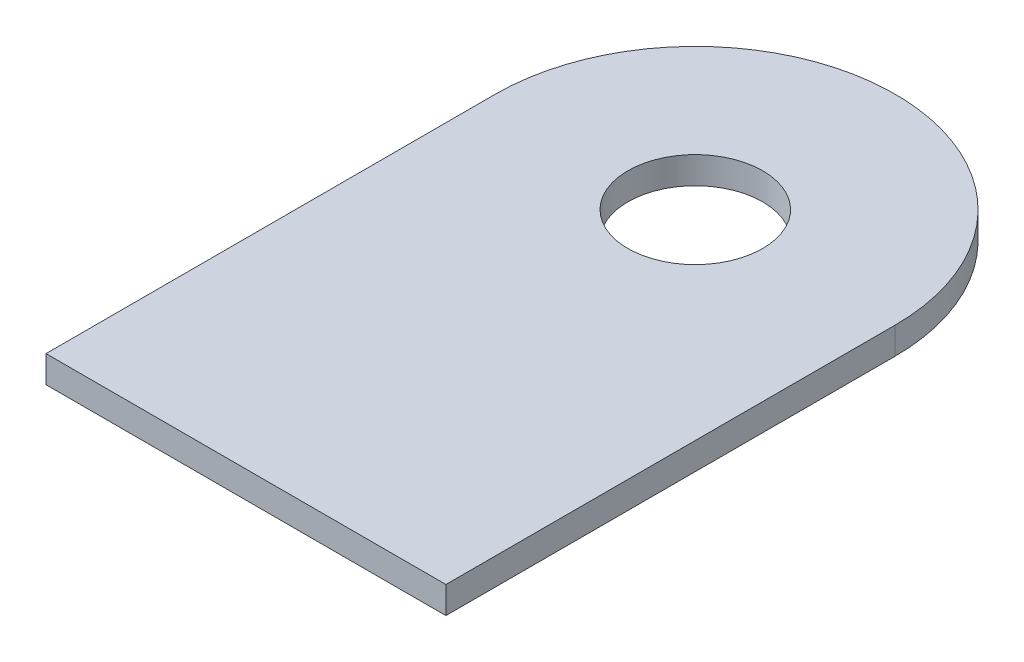
ISO-10303-21;
HEADER;
FILE_DESCRIPTION(('STEP AP214'),'2;1');
FILE_NAME('part.step','',(''),(''),'','','');
FILE_SCHEMA(('AUTOMOTIVE_DESIGN { 1 0 10303 214 1 1 1 1 }'));
ENDSEC;
DATA;
#1=APPLICATION_CONTEXT('core data for automotive mechanical design processes');
#2=APPLICATION_PROTOCOL_DEFINITION('international standard','automotive_design',2000,#1);
#3=PRODUCT_CONTEXT('',#1,'mechanical');
#4=PRODUCT('Part','Part','',(#3));
#5=PRODUCT_RELATED_PRODUCT_CATEGORY('part','',(#4));
#6=PRODUCT_DEFINITION_FORMATION('','',#4);
#7=PRODUCT_DEFINITION_CONTEXT('part definition',#1,'design');
#8=PRODUCT_DEFINITION('design','',#6,#7);
#9=PRODUCT_DEFINITION_SHAPE('','',#8);
#10=(LENGTH_UNIT() NAMED_UNIT(*) SI_UNIT(.MILLI.,.METRE.));
#11=(NAMED_UNIT(*) PLANE_ANGLE_UNIT() SI_UNIT($,.RADIAN.));
#12=(NAMED_UNIT(*) SI_UNIT($,.STERADIAN.) SOLID_ANGLE_UNIT());
#13=UNCERTAINTY_MEASURE_WITH_UNIT(LENGTH_MEASURE(1.E-05),#10,'distance_accuracy_value','');
#14=(GEOMETRIC_REPRESENTATION_CONTEXT(3) GLOBAL_UNCERTAINTY_ASSIGNED_CONTEXT((#13)) GLOBAL_UNIT_ASSIGNED_CONTEXT((#10,
#11,#12)) REPRESENTATION_CONTEXT('',''));
#15=CARTESIAN_POINT('',(0.,0.,0.));
#16=DIRECTION('',(0.,0.,1.));
#17=DIRECTION('',(1.,0.,0.));
#18=AXIS2_PLACEMENT_3D('',#15,#16,#17);
#19=CARTESIAN_POINT('',(0.,1.524,0.));
#20=DIRECTION('',(0.,-1.,0.));
#21=DIRECTION('',(0.,0.,-1.));
#22=AXIS2_PLACEMENT_3D('',#19,#20,#21);
#23=PLANE('',#22);
#24=DIRECTION('',(0.,0.,1.));
#25=VECTOR('',#24,1.);
#26=CARTESIAN_POINT('',(-11.303,1.524,25.4));
#27=LINE('',#26,#25);
#28=CARTESIAN_POINT('',(-11.303,1.524,0.));
#29=VERTEX_POINT('',#28);
#30=CARTESIAN_POINT('',(-11.303,1.524,25.4));
#31=VERTEX_POINT('',#30);
#32=EDGE_CURVE('E85',#29,#31,#27,.T.);
#33=ORIENTED_EDGE('',*,*,#32,.T.);
#34=DIRECTION('',(1.,0.,0.));
#35=VECTOR('',#34,1.);
#36=CARTESIAN_POINT('',(-11.303,1.524,25.4));
#37=LINE('',#36,#35);
#38=CARTESIAN_POINT('',(11.303,1.524,25.4));
#39=VERTEX_POINT('',#38);
#40=EDGE_CURVE('E80',#31,#39,#37,.T.);
#41=ORIENTED_EDGE('',*,*,#40,.T.);
#42=DIRECTION('',(0.,0.,-1.));
#43=VECTOR('',#42,1.);
#44=CARTESIAN_POINT('',(11.303,1.524,25.4));
#45=LINE('',#44,#43);
#46=CARTESIAN_POINT('',(11.303,1.524,0.));
#47=VERTEX_POINT('',#46);
#48=EDGE_CURVE('E83',#39,#47,#45,.T.);
#49=ORIENTED_EDGE('',*,*,#48,.T.);
#50=CARTESIAN_POINT('',(0.,1.524,0.));
#51=DIRECTION('',(0.,1.,0.));
#52=DIRECTION('',(0.,0.,-1.));
#53=AXIS2_PLACEMENT_3D('',#50,#51,#52);
#54=CIRCLE('',#53,11.303);
#55=EDGE_CURVE('E50',#47,#29,#54,.T.);
#56=ORIENTED_EDGE('',*,*,#55,.T.);
#57=EDGE_LOOP('',(#33,#41,#49,#56));
#58=FACE_BOUND('',#57,.T.);
#59=CARTESIAN_POINT('',(0.,1.524,0.));
#60=DIRECTION('',(0.,1.,0.));
#61=DIRECTION('',(0.,0.,1.));
#62=AXIS2_PLACEMENT_3D('',#59,#60,#61);
#63=CIRCLE('',#62,3.81);
#64=CARTESIAN_POINT('',(0.,1.524,-3.81));
#65=VERTEX_POINT('',#64);
#66=EDGE_CURVE('E100',#65,#65,#63,.T.);
#67=ORIENTED_EDGE('',*,*,#66,.F.);
#68=EDGE_LOOP('',(#67));
#69=FACE_BOUND('',#68,.T.);
#70=ADVANCED_FACE('F33',(#58,#69),#23,.F.);
#71=CARTESIAN_POINT('',(0.,0.,0.));
#72=DIRECTION('',(0.,-1.,0.));
#73=DIRECTION('',(0.,0.,-1.));
#74=AXIS2_PLACEMENT_3D('',#71,#72,#73);
#75=PLANE('',#74);
#76=DIRECTION('',(0.,0.,1.));
#77=VECTOR('',#76,1.);
#78=CARTESIAN_POINT('',(-11.303,0.,25.4));
#79=LINE('',#78,#77);
#80=CARTESIAN_POINT('',(-11.303,0.,0.));
#81=VERTEX_POINT('',#80);
#82=CARTESIAN_POINT('',(-11.303,0.,25.4));
#83=VERTEX_POINT('',#82);
#84=EDGE_CURVE('E97',#81,#83,#79,.T.);
#85=ORIENTED_EDGE('',*,*,#84,.F.);
#86=CARTESIAN_POINT('',(0.,0.,0.));
#87=DIRECTION('',(0.,1.,0.));
#88=DIRECTION('',(0.,0.,-1.));
#89=AXIS2_PLACEMENT_3D('',#86,#87,#88);
#90=CIRCLE('',#89,11.303);
#91=CARTESIAN_POINT('',(11.303,0.,0.));
#92=VERTEX_POINT('',#91);
#93=EDGE_CURVE('E73',#92,#81,#90,.T.);
#94=ORIENTED_EDGE('',*,*,#93,.F.);
#95=DIRECTION('',(0.,0.,-1.));
#96=VECTOR('',#95,1.);
#97=CARTESIAN_POINT('',(11.303,0.,25.4));
#98=LINE('',#97,#96);
#99=CARTESIAN_POINT('',(11.303,0.,25.4));
#100=VERTEX_POINT('',#99);
#101=EDGE_CURVE('E67',#100,#92,#98,.T.);
#102=ORIENTED_EDGE('',*,*,#101,.F.);
#103=DIRECTION('',(1.,0.,0.));
#104=VECTOR('',#103,1.);
#105=CARTESIAN_POINT('',(-11.303,0.,25.4));
#106=LINE('',#105,#104);
#107=EDGE_CURVE('E89',#83,#100,#106,.T.);
#108=ORIENTED_EDGE('',*,*,#107,.F.);
#109=EDGE_LOOP('',(#85,#94,#102,#108));
#110=FACE_BOUND('',#109,.T.);
#111=CARTESIAN_POINT('',(0.,0.,0.));
#112=DIRECTION('',(0.,1.,0.));
#113=DIRECTION('',(0.,0.,1.));
#114=AXIS2_PLACEMENT_3D('',#111,#112,#113);
#115=CIRCLE('',#114,3.81);
#116=CARTESIAN_POINT('',(0.,0.,-3.81));
#117=VERTEX_POINT('',#116);
#118=EDGE_CURVE('E112',#117,#117,#115,.T.);
#119=ORIENTED_EDGE('',*,*,#118,.T.);
#120=EDGE_LOOP('',(#119));
#121=FACE_BOUND('',#120,.T.);
#122=ADVANCED_FACE('F108',(#110,#121),#75,.T.);
#123=CARTESIAN_POINT('',(-11.303,1.524,25.4));
#124=DIRECTION('',(1.,0.,0.));
#125=DIRECTION('',(0.,0.,-1.));
#126=AXIS2_PLACEMENT_3D('',#123,#124,#125);
#127=PLANE('',#126);
#128=ORIENTED_EDGE('',*,*,#84,.T.);
#129=DIRECTION('',(0.,-1.,0.));
#130=VECTOR('',#129,1.);
#131=CARTESIAN_POINT('',(-11.303,1.524,25.4));
#132=LINE('',#131,#130);
#133=EDGE_CURVE('E11',#31,#83,#132,.T.);
#134=ORIENTED_EDGE('',*,*,#133,.F.);
#135=ORIENTED_EDGE('',*,*,#32,.F.);
#136=DIRECTION('',(0.,-1.,0.));
#137=VECTOR('',#136,1.);
#138=CARTESIAN_POINT('',(-11.303,1.524,0.));
#139=LINE('',#138,#137);
#140=EDGE_CURVE('E93',#29,#81,#139,.T.);
#141=ORIENTED_EDGE('',*,*,#140,.T.);
#142=EDGE_LOOP('',(#128,#134,#135,#141));
#143=FACE_BOUND('',#142,.T.);
#144=ADVANCED_FACE('F35',(#143),#127,.F.);
#145=CARTESIAN_POINT('',(-11.303,1.524,25.4));
#146=DIRECTION('',(0.,0.,-1.));
#147=DIRECTION('',(-1.,0.,0.));
#148=AXIS2_PLACEMENT_3D('',#145,#146,#147);
#149=PLANE('',#148);
#150=ORIENTED_EDGE('',*,*,#107,.T.);
#151=DIRECTION('',(0.,-1.,0.));
#152=VECTOR('',#151,1.);
#153=CARTESIAN_POINT('',(11.303,1.524,25.4));
#154=LINE('',#153,#152);
#155=EDGE_CURVE('E42',#39,#100,#154,.T.);
#156=ORIENTED_EDGE('',*,*,#155,.F.);
#157=ORIENTED_EDGE('',*,*,#40,.F.);
#158=ORIENTED_EDGE('',*,*,#133,.T.);
#159=EDGE_LOOP('',(#150,#156,#157,#158));
#160=FACE_BOUND('',#159,.T.);
#161=ADVANCED_FACE('F88',(#160),#149,.F.);
#162=CARTESIAN_POINT('',(11.303,1.524,25.4));
#163=DIRECTION('',(-1.,0.,0.));
#164=DIRECTION('',(0.,0.,1.));
#165=AXIS2_PLACEMENT_3D('',#162,#163,#164);
#166=PLANE('',#165);
#167=ORIENTED_EDGE('',*,*,#101,.T.);
#168=DIRECTION('',(0.,-1.,0.));
#169=VECTOR('',#168,1.);
#170=CARTESIAN_POINT('',(11.303,1.524,0.));
#171=LINE('',#170,#169);
#172=EDGE_CURVE('E90',#47,#92,#171,.T.);
#173=ORIENTED_EDGE('',*,*,#172,.F.);
#174=ORIENTED_EDGE('',*,*,#48,.F.);
#175=ORIENTED_EDGE('',*,*,#155,.T.);
#176=EDGE_LOOP('',(#167,#173,#174,#175));
#177=FACE_BOUND('',#176,.T.);
#178=ADVANCED_FACE('F91',(#177),#166,.F.);
#179=CARTESIAN_POINT('',(0.,1.524,0.));
#180=DIRECTION('',(0.,-1.,0.));
#181=DIRECTION('',(0.,0.,-1.));
#182=AXIS2_PLACEMENT_3D('',#179,#180,#181);
#183=CYLINDRICAL_SURFACE('',#182,11.303);
#184=ORIENTED_EDGE('',*,*,#93,.T.);
#185=ORIENTED_EDGE('',*,*,#140,.F.);
#186=ORIENTED_EDGE('',*,*,#55,.F.);
#187=ORIENTED_EDGE('',*,*,#172,.T.);
#188=EDGE_LOOP('',(#184,#185,#186,#187));
#189=FACE_BOUND('',#188,.T.);
#190=ADVANCED_FACE('F105',(#189),#183,.T.);
#191=CARTESIAN_POINT('',(0.,1.524,0.));
#192=DIRECTION('',(0.,-1.,0.));
#193=DIRECTION('',(0.,0.,-1.));
#194=AXIS2_PLACEMENT_3D('',#191,#192,#193);
#195=CYLINDRICAL_SURFACE('',#194,3.81);
#196=CARTESIAN_POINT('',(0.,1.524,-3.81));
#197=CARTESIAN_POINT('',(0.,1.508125,-3.81));
#198=CARTESIAN_POINT('',(0.,1.49225,-3.81));
#199=CARTESIAN_POINT('',(0.,1.4605,-3.81));
#200=CARTESIAN_POINT('',(0.,1.444625,-3.81));
#201=CARTESIAN_POINT('',(0.,1.412875,-3.81));
#202=CARTESIAN_POINT('',(0.,1.397,-3.81));
#203=CARTESIAN_POINT('',(0.,1.36525,-3.81));
#204=CARTESIAN_POINT('',(0.,1.349375,-3.81));
#205=CARTESIAN_POINT('',(0.,1.317625,-3.81));
#206=CARTESIAN_POINT('',(0.,1.30175,-3.81));
#207=CARTESIAN_POINT('',(0.,1.27,-3.81));
#208=CARTESIAN_POINT('',(0.,1.254125,-3.81));
#209=CARTESIAN_POINT('',(0.,1.222375,-3.81));
#210=CARTESIAN_POINT('',(0.,1.2065,-3.81));
#211=CARTESIAN_POINT('',(0.,1.17475,-3.81));
#212=CARTESIAN_POINT('',(0.,1.158875,-3.81));
#213=CARTESIAN_POINT('',(0.,1.127125,-3.81));
#214=CARTESIAN_POINT('',(0.,1.11125,-3.81));
#215=CARTESIAN_POINT('',(0.,1.0795,-3.81));
#216=CARTESIAN_POINT('',(0.,1.063625,-3.81));
#217=CARTESIAN_POINT('',(0.,1.031875,-3.81));
#218=CARTESIAN_POINT('',(0.,1.016,-3.81));
#219=CARTESIAN_POINT('',(0.,0.98425,-3.81));
#220=CARTESIAN_POINT('',(0.,0.968375,-3.81));
#221=CARTESIAN_POINT('',(0.,0.936625,-3.81));
#222=CARTESIAN_POINT('',(0.,0.92075,-3.81));
#223=CARTESIAN_POINT('',(0.,0.889,-3.81));
#224=CARTESIAN_POINT('',(0.,0.873125,-3.81));
#225=CARTESIAN_POINT('',(0.,0.841375,-3.81));
#226=CARTESIAN_POINT('',(0.,0.8255,-3.81));
#227=CARTESIAN_POINT('',(0.,0.79375,-3.81));
#228=CARTESIAN_POINT('',(0.,0.777875,-3.81));
#229=CARTESIAN_POINT('',(0.,0.746125,-3.81));
#230=CARTESIAN_POINT('',(0.,0.73025,-3.81));
#231=CARTESIAN_POINT('',(0.,0.6985,-3.81));
#232=CARTESIAN_POINT('',(0.,0.682625,-3.81));
#233=CARTESIAN_POINT('',(0.,0.650875,-3.81));
#234=CARTESIAN_POINT('',(0.,0.635,-3.81));
#235=CARTESIAN_POINT('',(0.,0.60325,-3.81));
#236=CARTESIAN_POINT('',(0.,0.587375,-3.81));
#237=CARTESIAN_POINT('',(0.,0.555625,-3.81));
#238=CARTESIAN_POINT('',(0.,0.53975,-3.81));
#239=CARTESIAN_POINT('',(0.,0.508,-3.81));
#240=CARTESIAN_POINT('',(0.,0.492125,-3.81));
#241=CARTESIAN_POINT('',(0.,0.460375,-3.81));
#242=CARTESIAN_POINT('',(0.,0.4445,-3.81));
#243=CARTESIAN_POINT('',(0.,0.41275,-3.81));
#244=CARTESIAN_POINT('',(0.,0.396875,-3.81));
#245=CARTESIAN_POINT('',(0.,0.365125,-3.81));
#246=CARTESIAN_POINT('',(0.,0.34925,-3.81));
#247=CARTESIAN_POINT('',(0.,0.3175,-3.81));
#248=CARTESIAN_POINT('',(0.,0.301625,-3.81));
#249=CARTESIAN_POINT('',(0.,0.269875,-3.81));
#250=CARTESIAN_POINT('',(0.,0.254,-3.81));
#251=CARTESIAN_POINT('',(0.,0.22225,-3.81));
#252=CARTESIAN_POINT('',(0.,0.206375,-3.81));
#253=CARTESIAN_POINT('',(0.,0.174625,-3.81));
#254=CARTESIAN_POINT('',(0.,0.15875,-3.81));
#255=CARTESIAN_POINT('',(0.,0.127,-3.81));
#256=CARTESIAN_POINT('',(0.,0.111125,-3.81));
#257=CARTESIAN_POINT('',(0.,0.079375,-3.81));
#258=CARTESIAN_POINT('',(0.,0.0635,-3.81));
#259=CARTESIAN_POINT('',(0.,0.0317499999999999,-3.81));
#260=CARTESIAN_POINT('',(0.,0.015875,-3.81));
#261=CARTESIAN_POINT('',(0.,0.,-3.81));
#262=B_SPLINE_CURVE_WITH_KNOTS('',3,(#196,#197,#198,#199,#200,#201,#202,#203,#204,#205,#206,
#207,#208,#209,#210,#211,#212,#213,#214,#215,#216,#217,#218,#219,#220,#221,#222,#223,#224,#225,
#226,#227,#228,#229,#230,#231,#232,#233,#234,#235,#236,#237,#238,#239,#240,#241,#242,#243,#244,
#245,#246,#247,#248,#249,#250,#251,#252,#253,#254,#255,#256,#257,#258,#259,#260,#261),
.UNSPECIFIED.,.F.,.F.,(4,2,2,2,2,2,2,2,2,2,2,2,2,2,2,2,2,2,2,2,2,2,2,2,2,2,2,2,2,2,2,2,4),(0.,
0.0476250000000001,0.0952500000000001,0.142875,0.1905,0.238125,0.28575,0.333375,0.381,0.428625,
0.47625,0.523875,0.5715,0.619125,0.66675,0.714375,0.762,0.809625,0.85725,0.904875,0.9525,
1.000125,1.04775,1.095375,1.143,1.190625,1.23825,1.285875,1.3335,1.381125,1.42875,1.476375,
1.524),.UNSPECIFIED.);
#263=EDGE_CURVE('BSEAM118',#65,#117,#262,.T.);
#264=ORIENTED_EDGE('',*,*,#66,.T.);
#265=ORIENTED_EDGE('',*,*,#118,.F.);
#266=ORIENTED_EDGE('',*,*,#263,.T.);
#267=ORIENTED_EDGE('',*,*,#263,.F.);
#268=EDGE_LOOP('',(#264,#266,#265,#267));
#269=FACE_BOUND('',#268,.T.);
#270=ADVANCED_FACE('F118',(#269),#195,.F.);
#271=CLOSED_SHELL('',(#70,#122,#144,#161,#178,#190,#270));
#272=MANIFOLD_SOLID_BREP('B2',#271);
#273=ADVANCED_BREP_SHAPE_REPRESENTATION('',(#18,#272),#14);
#274=SHAPE_DEFINITION_REPRESENTATION(#9,#273);
ENDSEC;
END-ISO-10303-21;
